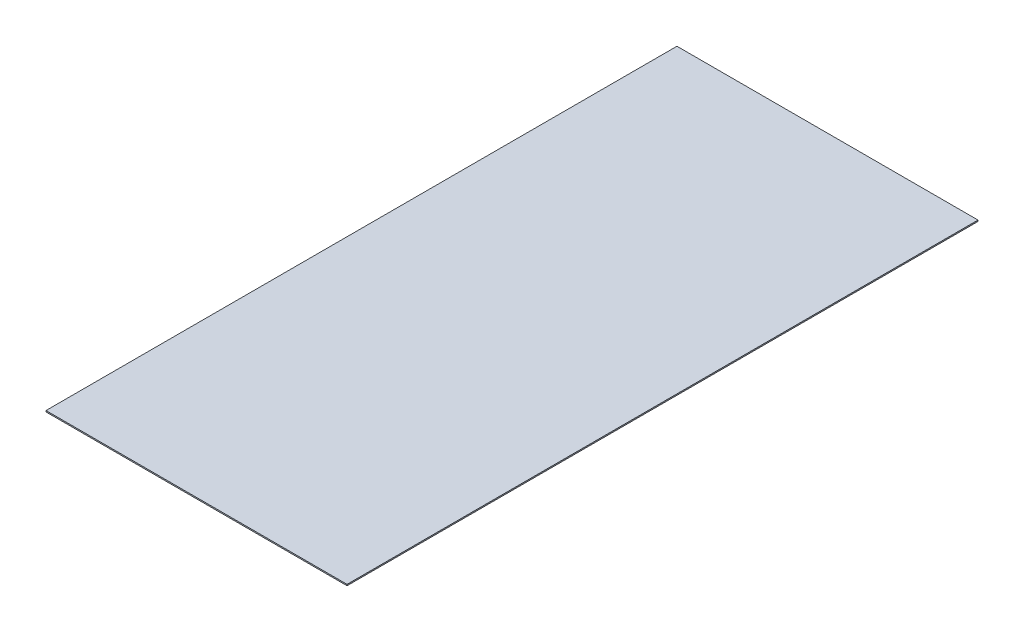
ISO-10303-21;
HEADER;
FILE_DESCRIPTION(('STEP AP214'),'2;1');
FILE_NAME('part.step','',(''),(''),'','','');
FILE_SCHEMA(('AUTOMOTIVE_DESIGN { 1 0 10303 214 1 1 1 1 }'));
ENDSEC;
DATA;
#1=APPLICATION_CONTEXT('core data for automotive mechanical design processes');
#2=APPLICATION_PROTOCOL_DEFINITION('international standard','automotive_design',2000,#1);
#3=PRODUCT_CONTEXT('',#1,'mechanical');
#4=PRODUCT('Part','Part','',(#3));
#5=PRODUCT_RELATED_PRODUCT_CATEGORY('part','',(#4));
#6=PRODUCT_DEFINITION_FORMATION('','',#4);
#7=PRODUCT_DEFINITION_CONTEXT('part definition',#1,'design');
#8=PRODUCT_DEFINITION('design','',#6,#7);
#9=PRODUCT_DEFINITION_SHAPE('','',#8);
#10=(LENGTH_UNIT() NAMED_UNIT(*) SI_UNIT(.MILLI.,.METRE.));
#11=(NAMED_UNIT(*) PLANE_ANGLE_UNIT() SI_UNIT($,.RADIAN.));
#12=(NAMED_UNIT(*) SI_UNIT($,.STERADIAN.) SOLID_ANGLE_UNIT());
#13=UNCERTAINTY_MEASURE_WITH_UNIT(LENGTH_MEASURE(1.E-05),#10,'distance_accuracy_value','');
#14=(GEOMETRIC_REPRESENTATION_CONTEXT(3) GLOBAL_UNCERTAINTY_ASSIGNED_CONTEXT((#13)) GLOBAL_UNIT_ASSIGNED_CONTEXT((#10,
#11,#12)) REPRESENTATION_CONTEXT('',''));
#15=CARTESIAN_POINT('',(0.,0.,0.));
#16=DIRECTION('',(0.,0.,1.));
#17=DIRECTION('',(1.,0.,0.));
#18=AXIS2_PLACEMENT_3D('',#15,#16,#17);
#19=CARTESIAN_POINT('',(-24.,0.,50.3));
#20=DIRECTION('',(0.,1.,0.));
#21=DIRECTION('',(0.,0.,1.));
#22=AXIS2_PLACEMENT_3D('',#19,#20,#21);
#23=PLANE('',#22);
#24=DIRECTION('',(0.,0.,-1.));
#25=VECTOR('',#24,1.);
#26=CARTESIAN_POINT('',(24.,0.,-50.3));
#27=LINE('',#26,#25);
#28=CARTESIAN_POINT('',(24.,0.,-50.3));
#29=VERTEX_POINT('',#28);
#30=CARTESIAN_POINT('',(24.,0.,50.3));
#31=VERTEX_POINT('',#30);
#32=EDGE_CURVE('E58',#29,#31,#27,.F.);
#33=ORIENTED_EDGE('',*,*,#32,.F.);
#34=DIRECTION('',(-1.,0.,0.));
#35=VECTOR('',#34,1.);
#36=CARTESIAN_POINT('',(-24.,0.,-50.3));
#37=LINE('',#36,#35);
#38=CARTESIAN_POINT('',(-24.,0.,-50.3));
#39=VERTEX_POINT('',#38);
#40=EDGE_CURVE('E53',#39,#29,#37,.F.);
#41=ORIENTED_EDGE('',*,*,#40,.F.);
#42=DIRECTION('',(0.,0.,1.));
#43=VECTOR('',#42,1.);
#44=CARTESIAN_POINT('',(-24.,0.,-50.3));
#45=LINE('',#44,#43);
#46=CARTESIAN_POINT('',(-24.,0.,50.3));
#47=VERTEX_POINT('',#46);
#48=EDGE_CURVE('E68',#47,#39,#45,.F.);
#49=ORIENTED_EDGE('',*,*,#48,.F.);
#50=DIRECTION('',(1.,0.,0.));
#51=VECTOR('',#50,1.);
#52=CARTESIAN_POINT('',(-24.,0.,50.3));
#53=LINE('',#52,#51);
#54=EDGE_CURVE('E20',#31,#47,#53,.F.);
#55=ORIENTED_EDGE('',*,*,#54,.F.);
#56=EDGE_LOOP('',(#33,#41,#49,#55));
#57=FACE_BOUND('',#56,.T.);
#58=ADVANCED_FACE('F17',(#57),#23,.T.);
#59=CARTESIAN_POINT('',(-24.,-0.2,50.3));
#60=DIRECTION('',(0.,0.,1.));
#61=DIRECTION('',(1.,0.,0.));
#62=AXIS2_PLACEMENT_3D('',#59,#60,#61);
#63=PLANE('',#62);
#64=DIRECTION('',(1.,0.,0.));
#65=VECTOR('',#64,1.);
#66=CARTESIAN_POINT('',(-24.,-0.2,50.3));
#67=LINE('',#66,#65);
#68=CARTESIAN_POINT('',(-24.,-0.2,50.3));
#69=VERTEX_POINT('',#68);
#70=CARTESIAN_POINT('',(24.,-0.2,50.3));
#71=VERTEX_POINT('',#70);
#72=EDGE_CURVE('E74',#69,#71,#67,.T.);
#73=ORIENTED_EDGE('',*,*,#72,.T.);
#74=DIRECTION('',(0.,1.,0.));
#75=VECTOR('',#74,1.);
#76=CARTESIAN_POINT('',(24.,-0.2,50.3));
#77=LINE('',#76,#75);
#78=EDGE_CURVE('E63',#31,#71,#77,.F.);
#79=ORIENTED_EDGE('',*,*,#78,.F.);
#80=ORIENTED_EDGE('',*,*,#54,.T.);
#81=DIRECTION('',(0.,1.,0.));
#82=VECTOR('',#81,1.);
#83=CARTESIAN_POINT('',(-24.,-0.2,50.3));
#84=LINE('',#83,#82);
#85=EDGE_CURVE('E81',#69,#47,#84,.T.);
#86=ORIENTED_EDGE('',*,*,#85,.F.);
#87=EDGE_LOOP('',(#73,#79,#80,#86));
#88=FACE_BOUND('',#87,.T.);
#89=ADVANCED_FACE('F73',(#88),#63,.T.);
#90=CARTESIAN_POINT('',(24.,-0.2,-50.3));
#91=DIRECTION('',(1.,0.,0.));
#92=DIRECTION('',(0.,0.,-1.));
#93=AXIS2_PLACEMENT_3D('',#90,#91,#92);
#94=PLANE('',#93);
#95=DIRECTION('',(0.,0.,1.));
#96=VECTOR('',#95,1.);
#97=CARTESIAN_POINT('',(24.,-0.2,50.3));
#98=LINE('',#97,#96);
#99=CARTESIAN_POINT('',(24.,-0.2,-50.3));
#100=VERTEX_POINT('',#99);
#101=EDGE_CURVE('E84',#71,#100,#98,.F.);
#102=ORIENTED_EDGE('',*,*,#101,.T.);
#103=DIRECTION('',(0.,1.,0.));
#104=VECTOR('',#103,1.);
#105=CARTESIAN_POINT('',(24.,-0.2,-50.3));
#106=LINE('',#105,#104);
#107=EDGE_CURVE('E65',#29,#100,#106,.F.);
#108=ORIENTED_EDGE('',*,*,#107,.F.);
#109=ORIENTED_EDGE('',*,*,#32,.T.);
#110=ORIENTED_EDGE('',*,*,#78,.T.);
#111=EDGE_LOOP('',(#102,#108,#109,#110));
#112=FACE_BOUND('',#111,.T.);
#113=ADVANCED_FACE('F61',(#112),#94,.T.);
#114=CARTESIAN_POINT('',(-24.,-0.2,-50.3));
#115=DIRECTION('',(0.,0.,-1.));
#116=DIRECTION('',(-1.,0.,0.));
#117=AXIS2_PLACEMENT_3D('',#114,#115,#116);
#118=PLANE('',#117);
#119=DIRECTION('',(1.,0.,0.));
#120=VECTOR('',#119,1.);
#121=CARTESIAN_POINT('',(-24.,-0.2,-50.3));
#122=LINE('',#121,#120);
#123=CARTESIAN_POINT('',(-24.,-0.2,-50.3));
#124=VERTEX_POINT('',#123);
#125=EDGE_CURVE('E26',#100,#124,#122,.F.);
#126=ORIENTED_EDGE('',*,*,#125,.T.);
#127=DIRECTION('',(0.,1.,0.));
#128=VECTOR('',#127,1.);
#129=CARTESIAN_POINT('',(-24.,-0.2,-50.3));
#130=LINE('',#129,#128);
#131=EDGE_CURVE('E34',#39,#124,#130,.F.);
#132=ORIENTED_EDGE('',*,*,#131,.F.);
#133=ORIENTED_EDGE('',*,*,#40,.T.);
#134=ORIENTED_EDGE('',*,*,#107,.T.);
#135=EDGE_LOOP('',(#126,#132,#133,#134));
#136=FACE_BOUND('',#135,.T.);
#137=ADVANCED_FACE('F88',(#136),#118,.T.);
#138=CARTESIAN_POINT('',(-24.,-0.2,-50.3));
#139=DIRECTION('',(-1.,0.,0.));
#140=DIRECTION('',(0.,0.,1.));
#141=AXIS2_PLACEMENT_3D('',#138,#139,#140);
#142=PLANE('',#141);
#143=DIRECTION('',(0.,0.,1.));
#144=VECTOR('',#143,1.);
#145=CARTESIAN_POINT('',(-24.,-0.2,50.3));
#146=LINE('',#145,#144);
#147=EDGE_CURVE('E11',#124,#69,#146,.T.);
#148=ORIENTED_EDGE('',*,*,#147,.T.);
#149=ORIENTED_EDGE('',*,*,#85,.T.);
#150=ORIENTED_EDGE('',*,*,#48,.T.);
#151=ORIENTED_EDGE('',*,*,#131,.T.);
#152=EDGE_LOOP('',(#148,#149,#150,#151));
#153=FACE_BOUND('',#152,.T.);
#154=ADVANCED_FACE('F91',(#153),#142,.T.);
#155=CARTESIAN_POINT('',(-24.,-0.2,50.3));
#156=DIRECTION('',(0.,1.,0.));
#157=DIRECTION('',(0.,0.,1.));
#158=AXIS2_PLACEMENT_3D('',#155,#156,#157);
#159=PLANE('',#158);
#160=ORIENTED_EDGE('',*,*,#125,.F.);
#161=ORIENTED_EDGE('',*,*,#101,.F.);
#162=ORIENTED_EDGE('',*,*,#72,.F.);
#163=ORIENTED_EDGE('',*,*,#147,.F.);
#164=EDGE_LOOP('',(#160,#161,#162,#163));
#165=FACE_BOUND('',#164,.T.);
#166=ADVANCED_FACE('F90',(#165),#159,.F.);
#167=CLOSED_SHELL('',(#58,#89,#113,#137,#154,#166));
#168=MANIFOLD_SOLID_BREP('B1',#167);
#169=ADVANCED_BREP_SHAPE_REPRESENTATION('',(#18,#168),#14);
#170=SHAPE_DEFINITION_REPRESENTATION(#9,#169);
ENDSEC;
END-ISO-10303-21;
